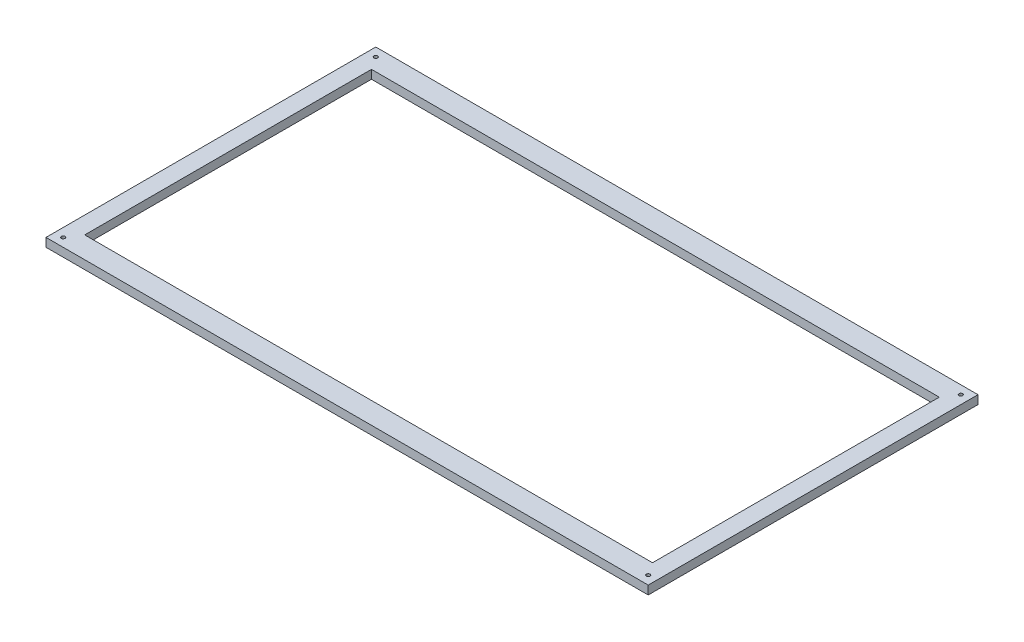
ISO-10303-21;
HEADER;
FILE_DESCRIPTION(('STEP AP214'),'2;1');
FILE_NAME('part.step','',(''),(''),'','','');
FILE_SCHEMA(('AUTOMOTIVE_DESIGN { 1 0 10303 214 1 1 1 1 }'));
ENDSEC;
DATA;
#1=APPLICATION_CONTEXT('core data for automotive mechanical design processes');
#2=APPLICATION_PROTOCOL_DEFINITION('international standard','automotive_design',2000,#1);
#3=PRODUCT_CONTEXT('',#1,'mechanical');
#4=PRODUCT('Part','Part','',(#3));
#5=PRODUCT_RELATED_PRODUCT_CATEGORY('part','',(#4));
#6=PRODUCT_DEFINITION_FORMATION('','',#4);
#7=PRODUCT_DEFINITION_CONTEXT('part definition',#1,'design');
#8=PRODUCT_DEFINITION('design','',#6,#7);
#9=PRODUCT_DEFINITION_SHAPE('','',#8);
#10=(LENGTH_UNIT() NAMED_UNIT(*) SI_UNIT(.MILLI.,.METRE.));
#11=(NAMED_UNIT(*) PLANE_ANGLE_UNIT() SI_UNIT($,.RADIAN.));
#12=(NAMED_UNIT(*) SI_UNIT($,.STERADIAN.) SOLID_ANGLE_UNIT());
#13=UNCERTAINTY_MEASURE_WITH_UNIT(LENGTH_MEASURE(1.E-05),#10,'distance_accuracy_value','');
#14=(GEOMETRIC_REPRESENTATION_CONTEXT(3) GLOBAL_UNCERTAINTY_ASSIGNED_CONTEXT((#13)) GLOBAL_UNIT_ASSIGNED_CONTEXT((#10,
#11,#12)) REPRESENTATION_CONTEXT('',''));
#15=CARTESIAN_POINT('',(0.,0.,0.));
#16=DIRECTION('',(0.,0.,1.));
#17=DIRECTION('',(1.,0.,0.));
#18=AXIS2_PLACEMENT_3D('',#15,#16,#17);
#19=CARTESIAN_POINT('',(-1050.,-30.,-575.));
#20=DIRECTION('',(-1.,0.,0.));
#21=DIRECTION('',(0.,0.,1.));
#22=AXIS2_PLACEMENT_3D('',#19,#20,#21);
#23=PLANE('',#22);
#24=DIRECTION('',(0.,0.,1.));
#25=VECTOR('',#24,1.);
#26=CARTESIAN_POINT('',(-1050.,0.,-575.));
#27=LINE('',#26,#25);
#28=CARTESIAN_POINT('',(-1050.,0.,-575.));
#29=VERTEX_POINT('',#28);
#30=CARTESIAN_POINT('',(-1050.,0.,575.));
#31=VERTEX_POINT('',#30);
#32=EDGE_CURVE('E151',#29,#31,#27,.T.);
#33=ORIENTED_EDGE('',*,*,#32,.F.);
#34=DIRECTION('',(0.,1.,0.));
#35=VECTOR('',#34,1.);
#36=CARTESIAN_POINT('',(-1050.,-30.,-575.));
#37=LINE('',#36,#35);
#38=CARTESIAN_POINT('',(-1050.,-30.,-575.));
#39=VERTEX_POINT('',#38);
#40=EDGE_CURVE('E11',#39,#29,#37,.T.);
#41=ORIENTED_EDGE('',*,*,#40,.F.);
#42=DIRECTION('',(0.,0.,1.));
#43=VECTOR('',#42,1.);
#44=CARTESIAN_POINT('',(-1050.,-30.,-575.));
#45=LINE('',#44,#43);
#46=CARTESIAN_POINT('',(-1050.,-30.,575.));
#47=VERTEX_POINT('',#46);
#48=EDGE_CURVE('E157',#39,#47,#45,.T.);
#49=ORIENTED_EDGE('',*,*,#48,.T.);
#50=DIRECTION('',(0.,1.,0.));
#51=VECTOR('',#50,1.);
#52=CARTESIAN_POINT('',(-1050.,-30.,575.));
#53=LINE('',#52,#51);
#54=EDGE_CURVE('E41',#47,#31,#53,.T.);
#55=ORIENTED_EDGE('',*,*,#54,.T.);
#56=EDGE_LOOP('',(#33,#41,#49,#55));
#57=FACE_BOUND('',#56,.T.);
#58=ADVANCED_FACE('F38',(#57),#23,.T.);
#59=CARTESIAN_POINT('',(-1050.,-30.,-575.));
#60=DIRECTION('',(0.,0.,-1.));
#61=DIRECTION('',(-1.,0.,0.));
#62=AXIS2_PLACEMENT_3D('',#59,#60,#61);
#63=PLANE('',#62);
#64=DIRECTION('',(-1.,0.,0.));
#65=VECTOR('',#64,1.);
#66=CARTESIAN_POINT('',(-1050.,0.,-575.));
#67=LINE('',#66,#65);
#68=CARTESIAN_POINT('',(1050.,0.,-575.));
#69=VERTEX_POINT('',#68);
#70=EDGE_CURVE('E162',#69,#29,#67,.T.);
#71=ORIENTED_EDGE('',*,*,#70,.F.);
#72=DIRECTION('',(0.,1.,0.));
#73=VECTOR('',#72,1.);
#74=CARTESIAN_POINT('',(1050.,-30.,-575.));
#75=LINE('',#74,#73);
#76=CARTESIAN_POINT('',(1050.,-30.,-575.));
#77=VERTEX_POINT('',#76);
#78=EDGE_CURVE('E47',#77,#69,#75,.T.);
#79=ORIENTED_EDGE('',*,*,#78,.F.);
#80=DIRECTION('',(-1.,0.,0.));
#81=VECTOR('',#80,1.);
#82=CARTESIAN_POINT('',(-1050.,-30.,-575.));
#83=LINE('',#82,#81);
#84=EDGE_CURVE('E170',#77,#39,#83,.T.);
#85=ORIENTED_EDGE('',*,*,#84,.T.);
#86=ORIENTED_EDGE('',*,*,#40,.T.);
#87=EDGE_LOOP('',(#71,#79,#85,#86));
#88=FACE_BOUND('',#87,.T.);
#89=ADVANCED_FACE('F204',(#88),#63,.T.);
#90=CARTESIAN_POINT('',(1050.,-30.,-575.));
#91=DIRECTION('',(1.,0.,0.));
#92=DIRECTION('',(0.,0.,-1.));
#93=AXIS2_PLACEMENT_3D('',#90,#91,#92);
#94=PLANE('',#93);
#95=DIRECTION('',(0.,0.,-1.));
#96=VECTOR('',#95,1.);
#97=CARTESIAN_POINT('',(1050.,0.,-575.));
#98=LINE('',#97,#96);
#99=CARTESIAN_POINT('',(1050.,0.,575.));
#100=VERTEX_POINT('',#99);
#101=EDGE_CURVE('E181',#100,#69,#98,.T.);
#102=ORIENTED_EDGE('',*,*,#101,.F.);
#103=DIRECTION('',(0.,1.,0.));
#104=VECTOR('',#103,1.);
#105=CARTESIAN_POINT('',(1050.,-30.,575.));
#106=LINE('',#105,#104);
#107=CARTESIAN_POINT('',(1050.,-30.,575.));
#108=VERTEX_POINT('',#107);
#109=EDGE_CURVE('E189',#108,#100,#106,.T.);
#110=ORIENTED_EDGE('',*,*,#109,.F.);
#111=DIRECTION('',(0.,0.,-1.));
#112=VECTOR('',#111,1.);
#113=CARTESIAN_POINT('',(1050.,-30.,-575.));
#114=LINE('',#113,#112);
#115=EDGE_CURVE('E166',#108,#77,#114,.T.);
#116=ORIENTED_EDGE('',*,*,#115,.T.);
#117=ORIENTED_EDGE('',*,*,#78,.T.);
#118=EDGE_LOOP('',(#102,#110,#116,#117));
#119=FACE_BOUND('',#118,.T.);
#120=ADVANCED_FACE('F208',(#119),#94,.T.);
#121=CARTESIAN_POINT('',(-1050.,-30.,575.));
#122=DIRECTION('',(0.,0.,1.));
#123=DIRECTION('',(1.,0.,0.));
#124=AXIS2_PLACEMENT_3D('',#121,#122,#123);
#125=PLANE('',#124);
#126=DIRECTION('',(1.,0.,0.));
#127=VECTOR('',#126,1.);
#128=CARTESIAN_POINT('',(-1050.,0.,575.));
#129=LINE('',#128,#127);
#130=EDGE_CURVE('E177',#31,#100,#129,.T.);
#131=ORIENTED_EDGE('',*,*,#130,.F.);
#132=ORIENTED_EDGE('',*,*,#54,.F.);
#133=DIRECTION('',(1.,0.,0.));
#134=VECTOR('',#133,1.);
#135=CARTESIAN_POINT('',(-1050.,-30.,575.));
#136=LINE('',#135,#134);
#137=EDGE_CURVE('E161',#47,#108,#136,.T.);
#138=ORIENTED_EDGE('',*,*,#137,.T.);
#139=ORIENTED_EDGE('',*,*,#109,.T.);
#140=EDGE_LOOP('',(#131,#132,#138,#139));
#141=FACE_BOUND('',#140,.T.);
#142=ADVANCED_FACE('F199',(#141),#125,.T.);
#143=CARTESIAN_POINT('',(0.,-30.,0.));
#144=DIRECTION('',(0.,1.,0.));
#145=DIRECTION('',(0.,0.,1.));
#146=AXIS2_PLACEMENT_3D('',#143,#144,#145);
#147=PLANE('',#146);
#148=CARTESIAN_POINT('',(-1020.,-30.,545.));
#149=DIRECTION('',(0.,1.,0.));
#150=DIRECTION('',(0.,0.,1.));
#151=AXIS2_PLACEMENT_3D('',#148,#149,#150);
#152=CIRCLE('',#151,6.35000000000015);
#153=CARTESIAN_POINT('',(-1020.,-30.,551.35));
#154=VERTEX_POINT('',#153);
#155=EDGE_CURVE('E329',#154,#154,#152,.T.);
#156=ORIENTED_EDGE('',*,*,#155,.T.);
#157=EDGE_LOOP('',(#156));
#158=FACE_BOUND('',#157,.T.);
#159=CARTESIAN_POINT('',(1020.,-30.,-545.));
#160=DIRECTION('',(0.,1.,0.));
#161=DIRECTION('',(0.,0.,1.));
#162=AXIS2_PLACEMENT_3D('',#159,#160,#161);
#163=CIRCLE('',#162,6.35000000000015);
#164=CARTESIAN_POINT('',(1020.,-30.,-538.65));
#165=VERTEX_POINT('',#164);
#166=EDGE_CURVE('E334',#165,#165,#163,.T.);
#167=ORIENTED_EDGE('',*,*,#166,.T.);
#168=EDGE_LOOP('',(#167));
#169=FACE_BOUND('',#168,.T.);
#170=CARTESIAN_POINT('',(1020.,-30.,545.));
#171=DIRECTION('',(0.,1.,0.));
#172=DIRECTION('',(0.,0.,1.));
#173=AXIS2_PLACEMENT_3D('',#170,#171,#172);
#174=CIRCLE('',#173,6.35000000000015);
#175=CARTESIAN_POINT('',(1020.,-30.,551.35));
#176=VERTEX_POINT('',#175);
#177=EDGE_CURVE('E346',#176,#176,#174,.T.);
#178=ORIENTED_EDGE('',*,*,#177,.T.);
#179=EDGE_LOOP('',(#178));
#180=FACE_BOUND('',#179,.T.);
#181=CARTESIAN_POINT('',(-1020.,-30.,-545.));
#182=DIRECTION('',(0.,1.,0.));
#183=DIRECTION('',(0.,0.,1.));
#184=AXIS2_PLACEMENT_3D('',#181,#182,#183);
#185=CIRCLE('',#184,6.35000000000015);
#186=CARTESIAN_POINT('',(-1020.,-30.,-538.65));
#187=VERTEX_POINT('',#186);
#188=EDGE_CURVE('E142',#187,#187,#185,.T.);
#189=ORIENTED_EDGE('',*,*,#188,.T.);
#190=EDGE_LOOP('',(#189));
#191=FACE_BOUND('',#190,.T.);
#192=DIRECTION('',(-1.,0.,0.));
#193=VECTOR('',#192,1.);
#194=CARTESIAN_POINT('',(-990.,-30.,-500.));
#195=LINE('',#194,#193);
#196=CARTESIAN_POINT('',(990.,-30.,-500.));
#197=VERTEX_POINT('',#196);
#198=CARTESIAN_POINT('',(-990.,-30.,-500.));
#199=VERTEX_POINT('',#198);
#200=EDGE_CURVE('E113',#197,#199,#195,.T.);
#201=ORIENTED_EDGE('',*,*,#200,.T.);
#202=DIRECTION('',(0.,0.,1.));
#203=VECTOR('',#202,1.);
#204=CARTESIAN_POINT('',(-990.,-30.,500.));
#205=LINE('',#204,#203);
#206=CARTESIAN_POINT('',(-990.,-30.,500.));
#207=VERTEX_POINT('',#206);
#208=EDGE_CURVE('E106',#199,#207,#205,.T.);
#209=ORIENTED_EDGE('',*,*,#208,.T.);
#210=DIRECTION('',(1.,0.,0.));
#211=VECTOR('',#210,1.);
#212=CARTESIAN_POINT('',(990.,-30.,500.));
#213=LINE('',#212,#211);
#214=CARTESIAN_POINT('',(990.,-30.,500.));
#215=VERTEX_POINT('',#214);
#216=EDGE_CURVE('E116',#207,#215,#213,.T.);
#217=ORIENTED_EDGE('',*,*,#216,.T.);
#218=DIRECTION('',(0.,0.,-1.));
#219=VECTOR('',#218,1.);
#220=CARTESIAN_POINT('',(990.,-30.,-500.));
#221=LINE('',#220,#219);
#222=EDGE_CURVE('E55',#215,#197,#221,.T.);
#223=ORIENTED_EDGE('',*,*,#222,.T.);
#224=EDGE_LOOP('',(#201,#209,#217,#223));
#225=FACE_BOUND('',#224,.T.);
#226=ORIENTED_EDGE('',*,*,#48,.F.);
#227=ORIENTED_EDGE('',*,*,#84,.F.);
#228=ORIENTED_EDGE('',*,*,#115,.F.);
#229=ORIENTED_EDGE('',*,*,#137,.F.);
#230=EDGE_LOOP('',(#226,#227,#228,#229));
#231=FACE_BOUND('',#230,.T.);
#232=ADVANCED_FACE('F121',(#158,#169,#180,#191,#225,#231),#147,.F.);
#233=CARTESIAN_POINT('',(0.,0.,0.));
#234=DIRECTION('',(0.,1.,0.));
#235=DIRECTION('',(0.,0.,1.));
#236=AXIS2_PLACEMENT_3D('',#233,#234,#235);
#237=PLANE('',#236);
#238=CARTESIAN_POINT('',(-1020.,0.,545.));
#239=DIRECTION('',(0.,1.,0.));
#240=DIRECTION('',(0.,0.,1.));
#241=AXIS2_PLACEMENT_3D('',#238,#239,#240);
#242=CIRCLE('',#241,6.35000000000015);
#243=CARTESIAN_POINT('',(-1020.,0.,551.35));
#244=VERTEX_POINT('',#243);
#245=EDGE_CURVE('E332',#244,#244,#242,.T.);
#246=ORIENTED_EDGE('',*,*,#245,.F.);
#247=EDGE_LOOP('',(#246));
#248=FACE_BOUND('',#247,.T.);
#249=CARTESIAN_POINT('',(1020.,0.,-545.));
#250=DIRECTION('',(0.,1.,0.));
#251=DIRECTION('',(0.,0.,1.));
#252=AXIS2_PLACEMENT_3D('',#249,#250,#251);
#253=CIRCLE('',#252,6.35000000000015);
#254=CARTESIAN_POINT('',(1020.,0.,-538.65));
#255=VERTEX_POINT('',#254);
#256=EDGE_CURVE('E340',#255,#255,#253,.T.);
#257=ORIENTED_EDGE('',*,*,#256,.F.);
#258=EDGE_LOOP('',(#257));
#259=FACE_BOUND('',#258,.T.);
#260=CARTESIAN_POINT('',(1020.,0.,545.));
#261=DIRECTION('',(0.,1.,0.));
#262=DIRECTION('',(0.,0.,1.));
#263=AXIS2_PLACEMENT_3D('',#260,#261,#262);
#264=CIRCLE('',#263,6.35000000000015);
#265=CARTESIAN_POINT('',(1020.,0.,551.35));
#266=VERTEX_POINT('',#265);
#267=EDGE_CURVE('E363',#266,#266,#264,.T.);
#268=ORIENTED_EDGE('',*,*,#267,.F.);
#269=EDGE_LOOP('',(#268));
#270=FACE_BOUND('',#269,.T.);
#271=CARTESIAN_POINT('',(-1020.,0.,-545.));
#272=DIRECTION('',(0.,1.,0.));
#273=DIRECTION('',(0.,0.,1.));
#274=AXIS2_PLACEMENT_3D('',#271,#272,#273);
#275=CIRCLE('',#274,6.35000000000015);
#276=CARTESIAN_POINT('',(-1020.,0.,-538.65));
#277=VERTEX_POINT('',#276);
#278=EDGE_CURVE('E132',#277,#277,#275,.T.);
#279=ORIENTED_EDGE('',*,*,#278,.F.);
#280=EDGE_LOOP('',(#279));
#281=FACE_BOUND('',#280,.T.);
#282=DIRECTION('',(0.,0.,1.));
#283=VECTOR('',#282,1.);
#284=CARTESIAN_POINT('',(-990.,0.,500.));
#285=LINE('',#284,#283);
#286=CARTESIAN_POINT('',(-990.,0.,-500.));
#287=VERTEX_POINT('',#286);
#288=CARTESIAN_POINT('',(-990.,0.,500.));
#289=VERTEX_POINT('',#288);
#290=EDGE_CURVE('E63',#287,#289,#285,.T.);
#291=ORIENTED_EDGE('',*,*,#290,.F.);
#292=DIRECTION('',(-1.,0.,0.));
#293=VECTOR('',#292,1.);
#294=CARTESIAN_POINT('',(-990.,0.,-500.));
#295=LINE('',#294,#293);
#296=CARTESIAN_POINT('',(990.,0.,-500.));
#297=VERTEX_POINT('',#296);
#298=EDGE_CURVE('E125',#297,#287,#295,.T.);
#299=ORIENTED_EDGE('',*,*,#298,.F.);
#300=DIRECTION('',(0.,0.,-1.));
#301=VECTOR('',#300,1.);
#302=CARTESIAN_POINT('',(990.,0.,-500.));
#303=LINE('',#302,#301);
#304=CARTESIAN_POINT('',(990.,0.,500.));
#305=VERTEX_POINT('',#304);
#306=EDGE_CURVE('E129',#305,#297,#303,.T.);
#307=ORIENTED_EDGE('',*,*,#306,.F.);
#308=DIRECTION('',(1.,0.,0.));
#309=VECTOR('',#308,1.);
#310=CARTESIAN_POINT('',(990.,0.,500.));
#311=LINE('',#310,#309);
#312=EDGE_CURVE('E141',#289,#305,#311,.T.);
#313=ORIENTED_EDGE('',*,*,#312,.F.);
#314=EDGE_LOOP('',(#291,#299,#307,#313));
#315=FACE_BOUND('',#314,.T.);
#316=ORIENTED_EDGE('',*,*,#32,.T.);
#317=ORIENTED_EDGE('',*,*,#130,.T.);
#318=ORIENTED_EDGE('',*,*,#101,.T.);
#319=ORIENTED_EDGE('',*,*,#70,.T.);
#320=EDGE_LOOP('',(#316,#317,#318,#319));
#321=FACE_BOUND('',#320,.T.);
#322=ADVANCED_FACE('F201',(#248,#259,#270,#281,#315,#321),#237,.T.);
#323=CARTESIAN_POINT('',(-990.,-30.,500.));
#324=DIRECTION('',(-1.,0.,0.));
#325=DIRECTION('',(0.,0.,1.));
#326=AXIS2_PLACEMENT_3D('',#323,#324,#325);
#327=PLANE('',#326);
#328=ORIENTED_EDGE('',*,*,#290,.T.);
#329=DIRECTION('',(0.,1.,0.));
#330=VECTOR('',#329,1.);
#331=CARTESIAN_POINT('',(-990.,-30.,500.));
#332=LINE('',#331,#330);
#333=EDGE_CURVE('E102',#207,#289,#332,.T.);
#334=ORIENTED_EDGE('',*,*,#333,.F.);
#335=ORIENTED_EDGE('',*,*,#208,.F.);
#336=DIRECTION('',(0.,1.,0.));
#337=VECTOR('',#336,1.);
#338=CARTESIAN_POINT('',(-990.,-30.,-500.));
#339=LINE('',#338,#337);
#340=EDGE_CURVE('E148',#199,#287,#339,.T.);
#341=ORIENTED_EDGE('',*,*,#340,.T.);
#342=EDGE_LOOP('',(#328,#334,#335,#341));
#343=FACE_BOUND('',#342,.T.);
#344=ADVANCED_FACE('F104',(#343),#327,.F.);
#345=CARTESIAN_POINT('',(-990.,-30.,-500.));
#346=DIRECTION('',(0.,0.,-1.));
#347=DIRECTION('',(-1.,0.,0.));
#348=AXIS2_PLACEMENT_3D('',#345,#346,#347);
#349=PLANE('',#348);
#350=ORIENTED_EDGE('',*,*,#298,.T.);
#351=ORIENTED_EDGE('',*,*,#340,.F.);
#352=ORIENTED_EDGE('',*,*,#200,.F.);
#353=DIRECTION('',(0.,1.,0.));
#354=VECTOR('',#353,1.);
#355=CARTESIAN_POINT('',(990.,-30.,-500.));
#356=LINE('',#355,#354);
#357=EDGE_CURVE('E152',#197,#297,#356,.T.);
#358=ORIENTED_EDGE('',*,*,#357,.T.);
#359=EDGE_LOOP('',(#350,#351,#352,#358));
#360=FACE_BOUND('',#359,.T.);
#361=ADVANCED_FACE('F244',(#360),#349,.F.);
#362=CARTESIAN_POINT('',(990.,-30.,-500.));
#363=DIRECTION('',(1.,0.,0.));
#364=DIRECTION('',(0.,0.,-1.));
#365=AXIS2_PLACEMENT_3D('',#362,#363,#364);
#366=PLANE('',#365);
#367=ORIENTED_EDGE('',*,*,#306,.T.);
#368=ORIENTED_EDGE('',*,*,#357,.F.);
#369=ORIENTED_EDGE('',*,*,#222,.F.);
#370=DIRECTION('',(0.,1.,0.));
#371=VECTOR('',#370,1.);
#372=CARTESIAN_POINT('',(990.,-30.,500.));
#373=LINE('',#372,#371);
#374=EDGE_CURVE('E112',#215,#305,#373,.T.);
#375=ORIENTED_EDGE('',*,*,#374,.T.);
#376=EDGE_LOOP('',(#367,#368,#369,#375));
#377=FACE_BOUND('',#376,.T.);
#378=ADVANCED_FACE('F255',(#377),#366,.F.);
#379=CARTESIAN_POINT('',(990.,-30.,500.));
#380=DIRECTION('',(0.,0.,1.));
#381=DIRECTION('',(1.,0.,0.));
#382=AXIS2_PLACEMENT_3D('',#379,#380,#381);
#383=PLANE('',#382);
#384=ORIENTED_EDGE('',*,*,#312,.T.);
#385=ORIENTED_EDGE('',*,*,#374,.F.);
#386=ORIENTED_EDGE('',*,*,#216,.F.);
#387=ORIENTED_EDGE('',*,*,#333,.T.);
#388=EDGE_LOOP('',(#384,#385,#386,#387));
#389=FACE_BOUND('',#388,.T.);
#390=ADVANCED_FACE('F117',(#389),#383,.F.);
#391=CARTESIAN_POINT('',(-1020.,-30.,-545.));
#392=DIRECTION('',(0.,1.,0.));
#393=DIRECTION('',(0.,0.,1.));
#394=AXIS2_PLACEMENT_3D('',#391,#392,#393);
#395=CYLINDRICAL_SURFACE('',#394,6.35000000000015);
#396=ORIENTED_EDGE('',*,*,#188,.F.);
#397=EDGE_LOOP('',(#396));
#398=FACE_BOUND('',#397,.T.);
#399=ORIENTED_EDGE('',*,*,#278,.T.);
#400=EDGE_LOOP('',(#399));
#401=FACE_BOUND('',#400,.T.);
#402=ADVANCED_FACE('F273',(#398,#401),#395,.F.);
#403=CARTESIAN_POINT('',(1020.,-30.,545.));
#404=DIRECTION('',(0.,1.,0.));
#405=DIRECTION('',(0.,0.,1.));
#406=AXIS2_PLACEMENT_3D('',#403,#404,#405);
#407=CYLINDRICAL_SURFACE('',#406,6.35000000000015);
#408=ORIENTED_EDGE('',*,*,#177,.F.);
#409=EDGE_LOOP('',(#408));
#410=FACE_BOUND('',#409,.T.);
#411=ORIENTED_EDGE('',*,*,#267,.T.);
#412=EDGE_LOOP('',(#411));
#413=FACE_BOUND('',#412,.T.);
#414=ADVANCED_FACE('F292',(#410,#413),#407,.F.);
#415=CARTESIAN_POINT('',(1020.,-30.,-545.));
#416=DIRECTION('',(0.,1.,0.));
#417=DIRECTION('',(0.,0.,1.));
#418=AXIS2_PLACEMENT_3D('',#415,#416,#417);
#419=CYLINDRICAL_SURFACE('',#418,6.35000000000015);
#420=ORIENTED_EDGE('',*,*,#166,.F.);
#421=EDGE_LOOP('',(#420));
#422=FACE_BOUND('',#421,.T.);
#423=ORIENTED_EDGE('',*,*,#256,.T.);
#424=EDGE_LOOP('',(#423));
#425=FACE_BOUND('',#424,.T.);
#426=ADVANCED_FACE('F302',(#422,#425),#419,.F.);
#427=CARTESIAN_POINT('',(-1020.,-30.,545.));
#428=DIRECTION('',(0.,1.,0.));
#429=DIRECTION('',(0.,0.,1.));
#430=AXIS2_PLACEMENT_3D('',#427,#428,#429);
#431=CYLINDRICAL_SURFACE('',#430,6.35000000000015);
#432=ORIENTED_EDGE('',*,*,#155,.F.);
#433=EDGE_LOOP('',(#432));
#434=FACE_BOUND('',#433,.T.);
#435=ORIENTED_EDGE('',*,*,#245,.T.);
#436=EDGE_LOOP('',(#435));
#437=FACE_BOUND('',#436,.T.);
#438=ADVANCED_FACE('F312',(#434,#437),#431,.F.);
#439=CLOSED_SHELL('',(#58,#89,#120,#142,#232,#322,#344,#361,#378,#390,#402,#414,#426,#438));
#440=MANIFOLD_SOLID_BREP('B2',#439);
#441=ADVANCED_BREP_SHAPE_REPRESENTATION('',(#18,#440),#14);
#442=SHAPE_DEFINITION_REPRESENTATION(#9,#441);
ENDSEC;
END-ISO-10303-21;
